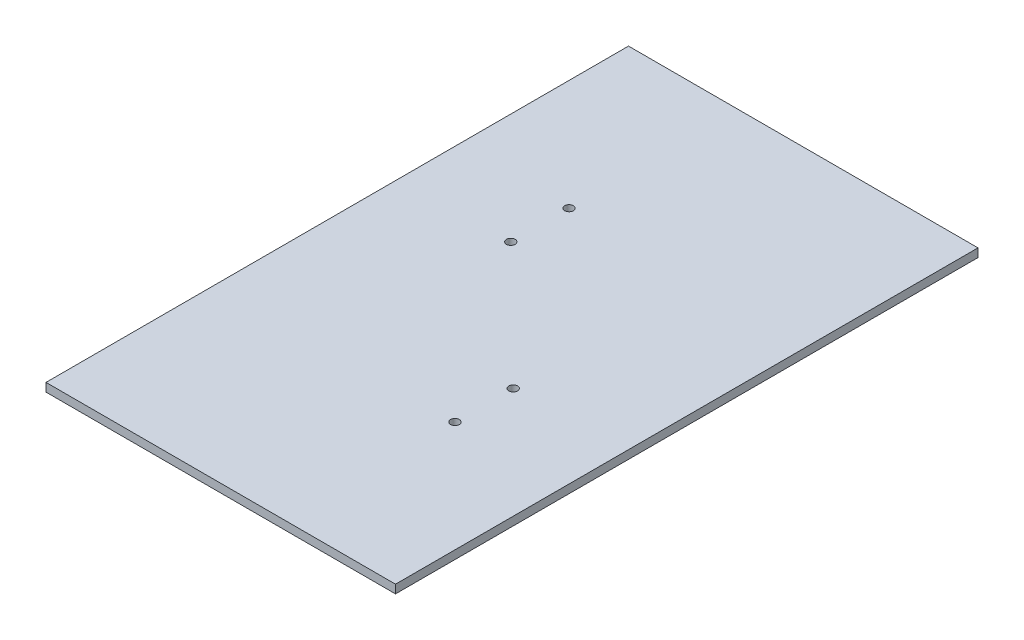
ISO-10303-21;
HEADER;
FILE_DESCRIPTION(('STEP AP214'),'2;1');
FILE_NAME('part.step','',(''),(''),'','','');
FILE_SCHEMA(('AUTOMOTIVE_DESIGN { 1 0 10303 214 1 1 1 1 }'));
ENDSEC;
DATA;
#1=APPLICATION_CONTEXT('core data for automotive mechanical design processes');
#2=APPLICATION_PROTOCOL_DEFINITION('international standard','automotive_design',2000,#1);
#3=PRODUCT_CONTEXT('',#1,'mechanical');
#4=PRODUCT('Part','Part','',(#3));
#5=PRODUCT_RELATED_PRODUCT_CATEGORY('part','',(#4));
#6=PRODUCT_DEFINITION_FORMATION('','',#4);
#7=PRODUCT_DEFINITION_CONTEXT('part definition',#1,'design');
#8=PRODUCT_DEFINITION('design','',#6,#7);
#9=PRODUCT_DEFINITION_SHAPE('','',#8);
#10=(LENGTH_UNIT() NAMED_UNIT(*) SI_UNIT(.MILLI.,.METRE.));
#11=(NAMED_UNIT(*) PLANE_ANGLE_UNIT() SI_UNIT($,.RADIAN.));
#12=(NAMED_UNIT(*) SI_UNIT($,.STERADIAN.) SOLID_ANGLE_UNIT());
#13=UNCERTAINTY_MEASURE_WITH_UNIT(LENGTH_MEASURE(1.E-05),#10,'distance_accuracy_value','');
#14=(GEOMETRIC_REPRESENTATION_CONTEXT(3) GLOBAL_UNCERTAINTY_ASSIGNED_CONTEXT((#13)) GLOBAL_UNIT_ASSIGNED_CONTEXT((#10,
#11,#12)) REPRESENTATION_CONTEXT('',''));
#15=CARTESIAN_POINT('',(0.,0.,0.));
#16=DIRECTION('',(0.,0.,1.));
#17=DIRECTION('',(1.,0.,0.));
#18=AXIS2_PLACEMENT_3D('',#15,#16,#17);
#19=CARTESIAN_POINT('',(0.,1.45,0.));
#20=DIRECTION('',(0.,1.,0.));
#21=DIRECTION('',(0.,0.,1.));
#22=AXIS2_PLACEMENT_3D('',#19,#20,#21);
#23=PLANE('',#22);
#24=CARTESIAN_POINT('',(22.,1.45,21.5783862067437));
#25=DIRECTION('',(0.,1.,0.));
#26=DIRECTION('',(0.,0.,1.));
#27=AXIS2_PLACEMENT_3D('',#24,#25,#26);
#28=CIRCLE('',#27,1.5);
#29=CARTESIAN_POINT('',(22.,1.45,23.0783862067437));
#30=VERTEX_POINT('',#29);
#31=EDGE_CURVE('E142',#30,#30,#28,.T.);
#32=ORIENTED_EDGE('',*,*,#31,.F.);
#33=EDGE_LOOP('',(#32));
#34=FACE_BOUND('',#33,.T.);
#35=CARTESIAN_POINT('',(-22.,1.45,-41.5783862067437));
#36=DIRECTION('',(0.,1.,0.));
#37=DIRECTION('',(0.,0.,1.));
#38=AXIS2_PLACEMENT_3D('',#35,#36,#37);
#39=CIRCLE('',#38,1.5);
#40=CARTESIAN_POINT('',(-22.,1.45,-40.0783862067437));
#41=VERTEX_POINT('',#40);
#42=EDGE_CURVE('E112',#41,#41,#39,.T.);
#43=ORIENTED_EDGE('',*,*,#42,.F.);
#44=EDGE_LOOP('',(#43));
#45=FACE_BOUND('',#44,.T.);
#46=DIRECTION('',(0.,0.,1.));
#47=VECTOR('',#46,1.);
#48=CARTESIAN_POINT('',(-60.,1.45,100.));
#49=LINE('',#48,#47);
#50=CARTESIAN_POINT('',(-60.,1.45,-100.));
#51=VERTEX_POINT('',#50);
#52=CARTESIAN_POINT('',(-60.,1.45,100.));
#53=VERTEX_POINT('',#52);
#54=EDGE_CURVE('E92',#51,#53,#49,.T.);
#55=ORIENTED_EDGE('',*,*,#54,.T.);
#56=DIRECTION('',(1.,0.,0.));
#57=VECTOR('',#56,1.);
#58=CARTESIAN_POINT('',(60.,1.45,100.));
#59=LINE('',#58,#57);
#60=CARTESIAN_POINT('',(60.,1.45,100.));
#61=VERTEX_POINT('',#60);
#62=EDGE_CURVE('E87',#53,#61,#59,.T.);
#63=ORIENTED_EDGE('',*,*,#62,.T.);
#64=DIRECTION('',(0.,0.,-1.));
#65=VECTOR('',#64,1.);
#66=CARTESIAN_POINT('',(60.,1.45,100.));
#67=LINE('',#66,#65);
#68=CARTESIAN_POINT('',(60.,1.45,-100.));
#69=VERTEX_POINT('',#68);
#70=EDGE_CURVE('E90',#61,#69,#67,.T.);
#71=ORIENTED_EDGE('',*,*,#70,.T.);
#72=DIRECTION('',(-1.,0.,0.));
#73=VECTOR('',#72,1.);
#74=CARTESIAN_POINT('',(60.,1.45,-100.));
#75=LINE('',#74,#73);
#76=EDGE_CURVE('E57',#69,#51,#75,.T.);
#77=ORIENTED_EDGE('',*,*,#76,.T.);
#78=EDGE_LOOP('',(#55,#63,#71,#77));
#79=FACE_BOUND('',#78,.T.);
#80=CARTESIAN_POINT('',(-22.,1.45,-21.5783862067437));
#81=DIRECTION('',(0.,1.,0.));
#82=DIRECTION('',(0.,0.,1.));
#83=AXIS2_PLACEMENT_3D('',#80,#81,#82);
#84=CIRCLE('',#83,1.5);
#85=CARTESIAN_POINT('',(-22.,1.45,-20.0783862067437));
#86=VERTEX_POINT('',#85);
#87=EDGE_CURVE('E134',#86,#86,#84,.T.);
#88=ORIENTED_EDGE('',*,*,#87,.F.);
#89=EDGE_LOOP('',(#88));
#90=FACE_BOUND('',#89,.T.);
#91=CARTESIAN_POINT('',(22.,1.45,41.5783862067437));
#92=DIRECTION('',(0.,1.,0.));
#93=DIRECTION('',(0.,0.,1.));
#94=AXIS2_PLACEMENT_3D('',#91,#92,#93);
#95=CIRCLE('',#94,1.5);
#96=CARTESIAN_POINT('',(22.,1.45,43.0783862067437));
#97=VERTEX_POINT('',#96);
#98=EDGE_CURVE('E150',#97,#97,#95,.T.);
#99=ORIENTED_EDGE('',*,*,#98,.F.);
#100=EDGE_LOOP('',(#99));
#101=FACE_BOUND('',#100,.T.);
#102=ADVANCED_FACE('F39',(#34,#45,#79,#90,#101),#23,.T.);
#103=CARTESIAN_POINT('',(0.,-1.45,0.));
#104=DIRECTION('',(0.,1.,0.));
#105=DIRECTION('',(0.,0.,1.));
#106=AXIS2_PLACEMENT_3D('',#103,#104,#105);
#107=PLANE('',#106);
#108=DIRECTION('',(0.,0.,1.));
#109=VECTOR('',#108,1.);
#110=CARTESIAN_POINT('',(-60.,-1.45,100.));
#111=LINE('',#110,#109);
#112=CARTESIAN_POINT('',(-60.,-1.45,-100.));
#113=VERTEX_POINT('',#112);
#114=CARTESIAN_POINT('',(-60.,-1.45,100.));
#115=VERTEX_POINT('',#114);
#116=EDGE_CURVE('E108',#113,#115,#111,.T.);
#117=ORIENTED_EDGE('',*,*,#116,.F.);
#118=DIRECTION('',(-1.,0.,0.));
#119=VECTOR('',#118,1.);
#120=CARTESIAN_POINT('',(60.,-1.45,-100.));
#121=LINE('',#120,#119);
#122=CARTESIAN_POINT('',(60.,-1.45,-100.));
#123=VERTEX_POINT('',#122);
#124=EDGE_CURVE('E80',#123,#113,#121,.T.);
#125=ORIENTED_EDGE('',*,*,#124,.F.);
#126=DIRECTION('',(0.,0.,-1.));
#127=VECTOR('',#126,1.);
#128=CARTESIAN_POINT('',(60.,-1.45,100.));
#129=LINE('',#128,#127);
#130=CARTESIAN_POINT('',(60.,-1.45,100.));
#131=VERTEX_POINT('',#130);
#132=EDGE_CURVE('E74',#131,#123,#129,.T.);
#133=ORIENTED_EDGE('',*,*,#132,.F.);
#134=DIRECTION('',(1.,0.,0.));
#135=VECTOR('',#134,1.);
#136=CARTESIAN_POINT('',(60.,-1.45,100.));
#137=LINE('',#136,#135);
#138=EDGE_CURVE('E97',#115,#131,#137,.T.);
#139=ORIENTED_EDGE('',*,*,#138,.F.);
#140=EDGE_LOOP('',(#117,#125,#133,#139));
#141=FACE_BOUND('',#140,.T.);
#142=CARTESIAN_POINT('',(-22.,-1.45,-41.5783862067437));
#143=DIRECTION('',(0.,1.,0.));
#144=DIRECTION('',(0.,0.,1.));
#145=AXIS2_PLACEMENT_3D('',#142,#143,#144);
#146=CIRCLE('',#145,1.5);
#147=CARTESIAN_POINT('',(-22.,-1.45,-40.0783862067437));
#148=VERTEX_POINT('',#147);
#149=EDGE_CURVE('E130',#148,#148,#146,.T.);
#150=ORIENTED_EDGE('',*,*,#149,.T.);
#151=EDGE_LOOP('',(#150));
#152=FACE_BOUND('',#151,.T.);
#153=CARTESIAN_POINT('',(-22.,-1.45,-21.5783862067437));
#154=DIRECTION('',(0.,1.,0.));
#155=DIRECTION('',(0.,0.,1.));
#156=AXIS2_PLACEMENT_3D('',#153,#154,#155);
#157=CIRCLE('',#156,1.5);
#158=CARTESIAN_POINT('',(-22.,-1.45,-20.0783862067437));
#159=VERTEX_POINT('',#158);
#160=EDGE_CURVE('E138',#159,#159,#157,.T.);
#161=ORIENTED_EDGE('',*,*,#160,.T.);
#162=EDGE_LOOP('',(#161));
#163=FACE_BOUND('',#162,.T.);
#164=CARTESIAN_POINT('',(22.,-1.45,21.5783862067437));
#165=DIRECTION('',(0.,1.,0.));
#166=DIRECTION('',(0.,0.,1.));
#167=AXIS2_PLACEMENT_3D('',#164,#165,#166);
#168=CIRCLE('',#167,1.5);
#169=CARTESIAN_POINT('',(22.,-1.45,23.0783862067437));
#170=VERTEX_POINT('',#169);
#171=EDGE_CURVE('E146',#170,#170,#168,.T.);
#172=ORIENTED_EDGE('',*,*,#171,.T.);
#173=EDGE_LOOP('',(#172));
#174=FACE_BOUND('',#173,.T.);
#175=CARTESIAN_POINT('',(22.,-1.45,41.5783862067437));
#176=DIRECTION('',(0.,1.,0.));
#177=DIRECTION('',(0.,0.,1.));
#178=AXIS2_PLACEMENT_3D('',#175,#176,#177);
#179=CIRCLE('',#178,1.5);
#180=CARTESIAN_POINT('',(22.,-1.45,43.0783862067437));
#181=VERTEX_POINT('',#180);
#182=EDGE_CURVE('E154',#181,#181,#179,.T.);
#183=ORIENTED_EDGE('',*,*,#182,.T.);
#184=EDGE_LOOP('',(#183));
#185=FACE_BOUND('',#184,.T.);
#186=ADVANCED_FACE('F125',(#141,#152,#163,#174,#185),#107,.F.);
#187=CARTESIAN_POINT('',(-60.,1.45,100.));
#188=DIRECTION('',(1.,0.,0.));
#189=DIRECTION('',(0.,0.,-1.));
#190=AXIS2_PLACEMENT_3D('',#187,#188,#189);
#191=PLANE('',#190);
#192=ORIENTED_EDGE('',*,*,#116,.T.);
#193=DIRECTION('',(0.,-1.,0.));
#194=VECTOR('',#193,1.);
#195=CARTESIAN_POINT('',(-60.,1.45,100.));
#196=LINE('',#195,#194);
#197=EDGE_CURVE('E11',#53,#115,#196,.T.);
#198=ORIENTED_EDGE('',*,*,#197,.F.);
#199=ORIENTED_EDGE('',*,*,#54,.F.);
#200=DIRECTION('',(0.,-1.,0.));
#201=VECTOR('',#200,1.);
#202=CARTESIAN_POINT('',(-60.,1.45,-100.));
#203=LINE('',#202,#201);
#204=EDGE_CURVE('E104',#51,#113,#203,.T.);
#205=ORIENTED_EDGE('',*,*,#204,.T.);
#206=EDGE_LOOP('',(#192,#198,#199,#205));
#207=FACE_BOUND('',#206,.T.);
#208=ADVANCED_FACE('F41',(#207),#191,.F.);
#209=CARTESIAN_POINT('',(60.,1.45,100.));
#210=DIRECTION('',(0.,0.,-1.));
#211=DIRECTION('',(-1.,0.,0.));
#212=AXIS2_PLACEMENT_3D('',#209,#210,#211);
#213=PLANE('',#212);
#214=ORIENTED_EDGE('',*,*,#138,.T.);
#215=DIRECTION('',(0.,-1.,0.));
#216=VECTOR('',#215,1.);
#217=CARTESIAN_POINT('',(60.,1.45,100.));
#218=LINE('',#217,#216);
#219=EDGE_CURVE('E49',#61,#131,#218,.T.);
#220=ORIENTED_EDGE('',*,*,#219,.F.);
#221=ORIENTED_EDGE('',*,*,#62,.F.);
#222=ORIENTED_EDGE('',*,*,#197,.T.);
#223=EDGE_LOOP('',(#214,#220,#221,#222));
#224=FACE_BOUND('',#223,.T.);
#225=ADVANCED_FACE('F96',(#224),#213,.F.);
#226=CARTESIAN_POINT('',(60.,1.45,100.));
#227=DIRECTION('',(-1.,0.,0.));
#228=DIRECTION('',(0.,0.,1.));
#229=AXIS2_PLACEMENT_3D('',#226,#227,#228);
#230=PLANE('',#229);
#231=ORIENTED_EDGE('',*,*,#132,.T.);
#232=DIRECTION('',(0.,-1.,0.));
#233=VECTOR('',#232,1.);
#234=CARTESIAN_POINT('',(60.,1.45,-100.));
#235=LINE('',#234,#233);
#236=EDGE_CURVE('E99',#69,#123,#235,.T.);
#237=ORIENTED_EDGE('',*,*,#236,.F.);
#238=ORIENTED_EDGE('',*,*,#70,.F.);
#239=ORIENTED_EDGE('',*,*,#219,.T.);
#240=EDGE_LOOP('',(#231,#237,#238,#239));
#241=FACE_BOUND('',#240,.T.);
#242=ADVANCED_FACE('F100',(#241),#230,.F.);
#243=CARTESIAN_POINT('',(60.,1.45,-100.));
#244=DIRECTION('',(0.,0.,1.));
#245=DIRECTION('',(1.,0.,0.));
#246=AXIS2_PLACEMENT_3D('',#243,#244,#245);
#247=PLANE('',#246);
#248=ORIENTED_EDGE('',*,*,#124,.T.);
#249=ORIENTED_EDGE('',*,*,#204,.F.);
#250=ORIENTED_EDGE('',*,*,#76,.F.);
#251=ORIENTED_EDGE('',*,*,#236,.T.);
#252=EDGE_LOOP('',(#248,#249,#250,#251));
#253=FACE_BOUND('',#252,.T.);
#254=ADVANCED_FACE('F122',(#253),#247,.F.);
#255=CARTESIAN_POINT('',(-22.,1.45,-41.5783862067437));
#256=DIRECTION('',(0.,-1.,0.));
#257=DIRECTION('',(0.,0.,-1.));
#258=AXIS2_PLACEMENT_3D('',#255,#256,#257);
#259=CYLINDRICAL_SURFACE('',#258,1.5);
#260=ORIENTED_EDGE('',*,*,#42,.T.);
#261=EDGE_LOOP('',(#260));
#262=FACE_BOUND('',#261,.T.);
#263=ORIENTED_EDGE('',*,*,#149,.F.);
#264=EDGE_LOOP('',(#263));
#265=FACE_BOUND('',#264,.T.);
#266=ADVANCED_FACE('F175',(#262,#265),#259,.F.);
#267=CARTESIAN_POINT('',(-22.,1.45,-21.5783862067437));
#268=DIRECTION('',(0.,-1.,0.));
#269=DIRECTION('',(0.,0.,-1.));
#270=AXIS2_PLACEMENT_3D('',#267,#268,#269);
#271=CYLINDRICAL_SURFACE('',#270,1.5);
#272=ORIENTED_EDGE('',*,*,#87,.T.);
#273=EDGE_LOOP('',(#272));
#274=FACE_BOUND('',#273,.T.);
#275=ORIENTED_EDGE('',*,*,#160,.F.);
#276=EDGE_LOOP('',(#275));
#277=FACE_BOUND('',#276,.T.);
#278=ADVANCED_FACE('F221',(#274,#277),#271,.F.);
#279=CARTESIAN_POINT('',(22.,1.45,21.5783862067437));
#280=DIRECTION('',(0.,-1.,0.));
#281=DIRECTION('',(0.,0.,-1.));
#282=AXIS2_PLACEMENT_3D('',#279,#280,#281);
#283=CYLINDRICAL_SURFACE('',#282,1.5);
#284=ORIENTED_EDGE('',*,*,#31,.T.);
#285=EDGE_LOOP('',(#284));
#286=FACE_BOUND('',#285,.T.);
#287=ORIENTED_EDGE('',*,*,#171,.F.);
#288=EDGE_LOOP('',(#287));
#289=FACE_BOUND('',#288,.T.);
#290=ADVANCED_FACE('F229',(#286,#289),#283,.F.);
#291=CARTESIAN_POINT('',(22.,1.45,41.5783862067437));
#292=DIRECTION('',(0.,-1.,0.));
#293=DIRECTION('',(0.,0.,-1.));
#294=AXIS2_PLACEMENT_3D('',#291,#292,#293);
#295=CYLINDRICAL_SURFACE('',#294,1.5);
#296=ORIENTED_EDGE('',*,*,#98,.T.);
#297=EDGE_LOOP('',(#296));
#298=FACE_BOUND('',#297,.T.);
#299=ORIENTED_EDGE('',*,*,#182,.F.);
#300=EDGE_LOOP('',(#299));
#301=FACE_BOUND('',#300,.T.);
#302=ADVANCED_FACE('F162',(#298,#301),#295,.F.);
#303=CLOSED_SHELL('',(#102,#186,#208,#225,#242,#254,#266,#278,#290,#302));
#304=MANIFOLD_SOLID_BREP('B2',#303);
#305=ADVANCED_BREP_SHAPE_REPRESENTATION('',(#18,#304),#14);
#306=SHAPE_DEFINITION_REPRESENTATION(#9,#305);
ENDSEC;
END-ISO-10303-21;
